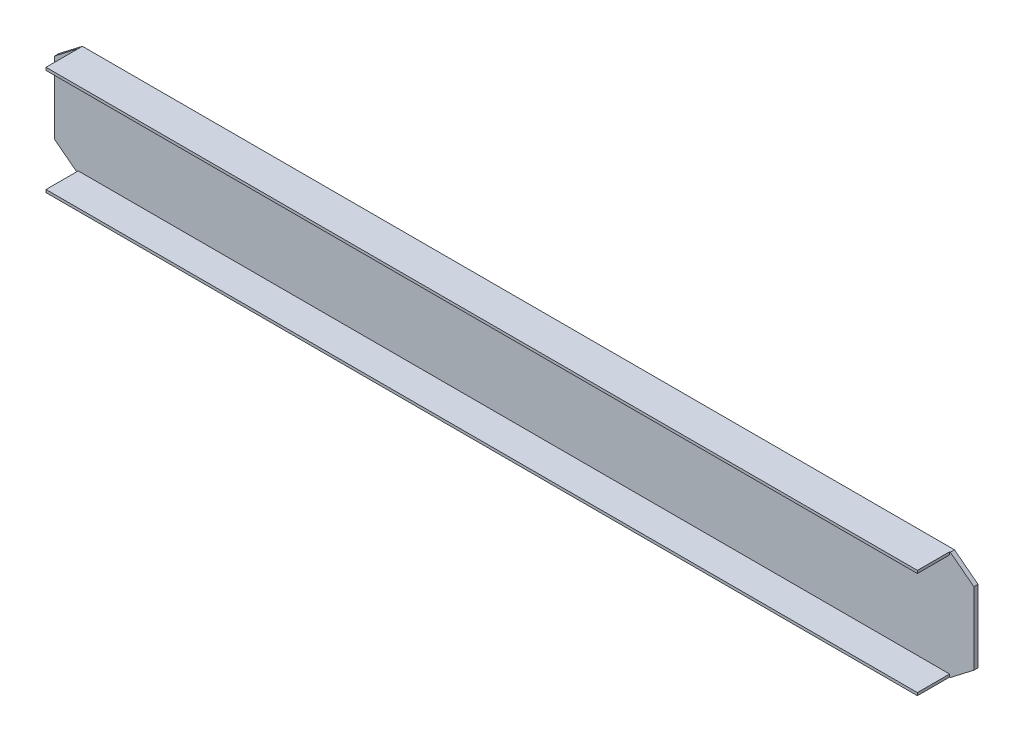
ISO-10303-21;
HEADER;
FILE_DESCRIPTION(('STEP AP214'),'2;1');
FILE_NAME('part.step','',(''),(''),'','','');
FILE_SCHEMA(('AUTOMOTIVE_DESIGN { 1 0 10303 214 1 1 1 1 }'));
ENDSEC;
DATA;
#1=APPLICATION_CONTEXT('core data for automotive mechanical design processes');
#2=APPLICATION_PROTOCOL_DEFINITION('international standard','automotive_design',2000,#1);
#3=PRODUCT_CONTEXT('',#1,'mechanical');
#4=PRODUCT('Part','Part','',(#3));
#5=PRODUCT_RELATED_PRODUCT_CATEGORY('part','',(#4));
#6=PRODUCT_DEFINITION_FORMATION('','',#4);
#7=PRODUCT_DEFINITION_CONTEXT('part definition',#1,'design');
#8=PRODUCT_DEFINITION('design','',#6,#7);
#9=PRODUCT_DEFINITION_SHAPE('','',#8);
#10=(LENGTH_UNIT() NAMED_UNIT(*) SI_UNIT(.MILLI.,.METRE.));
#11=(NAMED_UNIT(*) PLANE_ANGLE_UNIT() SI_UNIT($,.RADIAN.));
#12=(NAMED_UNIT(*) SI_UNIT($,.STERADIAN.) SOLID_ANGLE_UNIT());
#13=UNCERTAINTY_MEASURE_WITH_UNIT(LENGTH_MEASURE(1.E-05),#10,'distance_accuracy_value','');
#14=(GEOMETRIC_REPRESENTATION_CONTEXT(3) GLOBAL_UNCERTAINTY_ASSIGNED_CONTEXT((#13)) GLOBAL_UNIT_ASSIGNED_CONTEXT((#10,
#11,#12)) REPRESENTATION_CONTEXT('',''));
#15=CARTESIAN_POINT('',(0.,0.,0.));
#16=DIRECTION('',(0.,0.,1.));
#17=DIRECTION('',(1.,0.,0.));
#18=AXIS2_PLACEMENT_3D('',#15,#16,#17);
#19=CARTESIAN_POINT('',(0.,-926.923076923078,-11.5));
#20=DIRECTION('',(0.,0.,-1.));
#21=DIRECTION('',(-1.,0.,0.));
#22=AXIS2_PLACEMENT_3D('',#19,#20,#21);
#23=PLANE('',#22);
#24=DIRECTION('',(0.,-1.,0.));
#25=VECTOR('',#24,1.);
#26=CARTESIAN_POINT('',(-140.,270.,-11.5));
#27=LINE('',#26,#25);
#28=CARTESIAN_POINT('',(-140.,270.,-11.5));
#29=VERTEX_POINT('',#28);
#30=CARTESIAN_POINT('',(-140.,30.,-11.5));
#31=VERTEX_POINT('',#30);
#32=EDGE_CURVE('E267',#29,#31,#27,.T.);
#33=ORIENTED_EDGE('',*,*,#32,.F.);
#34=DIRECTION('',(1.,0.,0.));
#35=VECTOR('',#34,1.);
#36=CARTESIAN_POINT('',(-220.,270.,-11.5));
#37=LINE('',#36,#35);
#38=CARTESIAN_POINT('',(-220.,270.,-11.5));
#39=VERTEX_POINT('',#38);
#40=EDGE_CURVE('E264',#39,#29,#37,.T.);
#41=ORIENTED_EDGE('',*,*,#40,.F.);
#42=DIRECTION('',(0.,1.,0.));
#43=VECTOR('',#42,1.);
#44=CARTESIAN_POINT('',(-220.,270.,-11.5));
#45=LINE('',#44,#43);
#46=CARTESIAN_POINT('',(-220.,30.,-11.5));
#47=VERTEX_POINT('',#46);
#48=EDGE_CURVE('E276',#47,#39,#45,.T.);
#49=ORIENTED_EDGE('',*,*,#48,.F.);
#50=DIRECTION('',(-1.,0.,0.));
#51=VECTOR('',#50,1.);
#52=CARTESIAN_POINT('',(-220.,30.,-11.5));
#53=LINE('',#52,#51);
#54=EDGE_CURVE('E284',#31,#47,#53,.T.);
#55=ORIENTED_EDGE('',*,*,#54,.F.);
#56=EDGE_LOOP('',(#33,#41,#49,#55));
#57=FACE_BOUND('',#56,.T.);
#58=DIRECTION('',(-1.,0.,0.));
#59=VECTOR('',#58,1.);
#60=CARTESIAN_POINT('',(620.,30.,-11.5));
#61=LINE('',#60,#59);
#62=CARTESIAN_POINT('',(620.,30.,-11.5));
#63=VERTEX_POINT('',#62);
#64=CARTESIAN_POINT('',(540.,30.,-11.5));
#65=VERTEX_POINT('',#64);
#66=EDGE_CURVE('E338',#63,#65,#61,.T.);
#67=ORIENTED_EDGE('',*,*,#66,.F.);
#68=DIRECTION('',(0.,-1.,0.));
#69=VECTOR('',#68,1.);
#70=CARTESIAN_POINT('',(620.,270.,-11.5));
#71=LINE('',#70,#69);
#72=CARTESIAN_POINT('',(620.,270.,-11.5));
#73=VERTEX_POINT('',#72);
#74=EDGE_CURVE('E324',#73,#63,#71,.T.);
#75=ORIENTED_EDGE('',*,*,#74,.F.);
#76=DIRECTION('',(1.,0.,0.));
#77=VECTOR('',#76,1.);
#78=CARTESIAN_POINT('',(620.,270.,-11.5));
#79=LINE('',#78,#77);
#80=CARTESIAN_POINT('',(540.,270.,-11.5));
#81=VERTEX_POINT('',#80);
#82=EDGE_CURVE('E329',#81,#73,#79,.T.);
#83=ORIENTED_EDGE('',*,*,#82,.F.);
#84=DIRECTION('',(0.,1.,0.));
#85=VECTOR('',#84,1.);
#86=CARTESIAN_POINT('',(540.,270.,-11.5));
#87=LINE('',#86,#85);
#88=EDGE_CURVE('E340',#65,#81,#87,.T.);
#89=ORIENTED_EDGE('',*,*,#88,.F.);
#90=EDGE_LOOP('',(#67,#75,#83,#89));
#91=FACE_BOUND('',#90,.T.);
#92=DIRECTION('',(0.7926239891046,-0.609710760849693,0.));
#93=VECTOR('',#92,1.);
#94=CARTESIAN_POINT('',(-1270.,50.,-11.5));
#95=LINE('',#94,#93);
#96=CARTESIAN_POINT('',(-1270.,50.,-11.5));
#97=VERTEX_POINT('',#96);
#98=CARTESIAN_POINT('',(-1205.,0.,-11.5));
#99=VERTEX_POINT('',#98);
#100=EDGE_CURVE('E414',#97,#99,#95,.T.);
#101=ORIENTED_EDGE('',*,*,#100,.F.);
#102=DIRECTION('',(0.,-1.,0.));
#103=VECTOR('',#102,1.);
#104=CARTESIAN_POINT('',(-1270.,50.,-11.5));
#105=LINE('',#104,#103);
#106=CARTESIAN_POINT('',(-1270.,250.,-11.5));
#107=VERTEX_POINT('',#106);
#108=EDGE_CURVE('E436',#107,#97,#105,.T.);
#109=ORIENTED_EDGE('',*,*,#108,.F.);
#110=DIRECTION('',(-0.7926239891046,-0.609710760849693,0.));
#111=VECTOR('',#110,1.);
#112=CARTESIAN_POINT('',(-1270.,250.,-11.5));
#113=LINE('',#112,#111);
#114=CARTESIAN_POINT('',(-1205.,300.,-11.5));
#115=VERTEX_POINT('',#114);
#116=EDGE_CURVE('E433',#115,#107,#113,.T.);
#117=ORIENTED_EDGE('',*,*,#116,.F.);
#118=DIRECTION('',(-1.,0.,0.));
#119=VECTOR('',#118,1.);
#120=CARTESIAN_POINT('',(-1205.,300.,-11.5));
#121=LINE('',#120,#119);
#122=CARTESIAN_POINT('',(1205.,300.,-11.5));
#123=VERTEX_POINT('',#122);
#124=EDGE_CURVE('E430',#123,#115,#121,.T.);
#125=ORIENTED_EDGE('',*,*,#124,.F.);
#126=DIRECTION('',(-0.7926239891046,0.609710760849693,0.));
#127=VECTOR('',#126,1.);
#128=CARTESIAN_POINT('',(1270.,250.,-11.5));
#129=LINE('',#128,#127);
#130=CARTESIAN_POINT('',(1270.,250.,-11.5));
#131=VERTEX_POINT('',#130);
#132=EDGE_CURVE('E427',#131,#123,#129,.T.);
#133=ORIENTED_EDGE('',*,*,#132,.F.);
#134=DIRECTION('',(0.,1.,0.));
#135=VECTOR('',#134,1.);
#136=CARTESIAN_POINT('',(1270.,50.,-11.5));
#137=LINE('',#136,#135);
#138=CARTESIAN_POINT('',(1270.,50.,-11.5));
#139=VERTEX_POINT('',#138);
#140=EDGE_CURVE('E424',#139,#131,#137,.T.);
#141=ORIENTED_EDGE('',*,*,#140,.F.);
#142=DIRECTION('',(0.7926239891046,0.609710760849693,0.));
#143=VECTOR('',#142,1.);
#144=CARTESIAN_POINT('',(1270.,50.,-11.5));
#145=LINE('',#144,#143);
#146=CARTESIAN_POINT('',(1205.,0.,-11.5));
#147=VERTEX_POINT('',#146);
#148=EDGE_CURVE('E421',#147,#139,#145,.T.);
#149=ORIENTED_EDGE('',*,*,#148,.F.);
#150=DIRECTION('',(1.,0.,0.));
#151=VECTOR('',#150,1.);
#152=CARTESIAN_POINT('',(-1205.,0.,-11.5));
#153=LINE('',#152,#151);
#154=EDGE_CURVE('E417',#99,#147,#153,.T.);
#155=ORIENTED_EDGE('',*,*,#154,.F.);
#156=EDGE_LOOP('',(#101,#109,#117,#125,#133,#141,#149,#155));
#157=FACE_BOUND('',#156,.T.);
#158=DIRECTION('',(-1.,0.,0.));
#159=VECTOR('',#158,1.);
#160=CARTESIAN_POINT('',(220.,30.,-11.5));
#161=LINE('',#160,#159);
#162=CARTESIAN_POINT('',(220.,30.,-11.5));
#163=VERTEX_POINT('',#162);
#164=CARTESIAN_POINT('',(140.,30.,-11.5));
#165=VERTEX_POINT('',#164);
#166=EDGE_CURVE('E309',#163,#165,#161,.T.);
#167=ORIENTED_EDGE('',*,*,#166,.F.);
#168=DIRECTION('',(0.,-1.,0.));
#169=VECTOR('',#168,1.);
#170=CARTESIAN_POINT('',(220.,270.,-11.5));
#171=LINE('',#170,#169);
#172=CARTESIAN_POINT('',(220.,270.,-11.5));
#173=VERTEX_POINT('',#172);
#174=EDGE_CURVE('E295',#173,#163,#171,.T.);
#175=ORIENTED_EDGE('',*,*,#174,.F.);
#176=DIRECTION('',(1.,0.,0.));
#177=VECTOR('',#176,1.);
#178=CARTESIAN_POINT('',(220.,270.,-11.5));
#179=LINE('',#178,#177);
#180=CARTESIAN_POINT('',(140.,270.,-11.5));
#181=VERTEX_POINT('',#180);
#182=EDGE_CURVE('E300',#181,#173,#179,.T.);
#183=ORIENTED_EDGE('',*,*,#182,.F.);
#184=DIRECTION('',(0.,1.,0.));
#185=VECTOR('',#184,1.);
#186=CARTESIAN_POINT('',(140.,270.,-11.5));
#187=LINE('',#186,#185);
#188=EDGE_CURVE('E311',#165,#181,#187,.T.);
#189=ORIENTED_EDGE('',*,*,#188,.F.);
#190=EDGE_LOOP('',(#167,#175,#183,#189));
#191=FACE_BOUND('',#190,.T.);
#192=DIRECTION('',(0.,-1.,0.));
#193=VECTOR('',#192,1.);
#194=CARTESIAN_POINT('',(-540.,270.,-11.5));
#195=LINE('',#194,#193);
#196=CARTESIAN_POINT('',(-540.,270.,-11.5));
#197=VERTEX_POINT('',#196);
#198=CARTESIAN_POINT('',(-540.,30.,-11.5));
#199=VERTEX_POINT('',#198);
#200=EDGE_CURVE('E862',#197,#199,#195,.T.);
#201=ORIENTED_EDGE('',*,*,#200,.F.);
#202=DIRECTION('',(1.,0.,0.));
#203=VECTOR('',#202,1.);
#204=CARTESIAN_POINT('',(-620.,270.,-11.5));
#205=LINE('',#204,#203);
#206=CARTESIAN_POINT('',(-620.,270.,-11.5));
#207=VERTEX_POINT('',#206);
#208=EDGE_CURVE('E262',#207,#197,#205,.T.);
#209=ORIENTED_EDGE('',*,*,#208,.F.);
#210=DIRECTION('',(0.,1.,0.));
#211=VECTOR('',#210,1.);
#212=CARTESIAN_POINT('',(-620.,270.,-11.5));
#213=LINE('',#212,#211);
#214=CARTESIAN_POINT('',(-620.,30.,-11.5));
#215=VERTEX_POINT('',#214);
#216=EDGE_CURVE('E258',#215,#207,#213,.T.);
#217=ORIENTED_EDGE('',*,*,#216,.F.);
#218=DIRECTION('',(-1.,0.,0.));
#219=VECTOR('',#218,1.);
#220=CARTESIAN_POINT('',(-620.,30.,-11.5));
#221=LINE('',#220,#219);
#222=EDGE_CURVE('E864',#199,#215,#221,.T.);
#223=ORIENTED_EDGE('',*,*,#222,.F.);
#224=EDGE_LOOP('',(#201,#209,#217,#223));
#225=FACE_BOUND('',#224,.T.);
#226=ADVANCED_FACE('F34',(#57,#91,#157,#191,#225),#23,.T.);
#227=CARTESIAN_POINT('',(0.,-926.923076923078,0.));
#228=DIRECTION('',(0.,0.,-1.));
#229=DIRECTION('',(-1.,0.,0.));
#230=AXIS2_PLACEMENT_3D('',#227,#228,#229);
#231=PLANE('',#230);
#232=DIRECTION('',(0.,1.,0.));
#233=VECTOR('',#232,1.);
#234=CARTESIAN_POINT('',(1203.04903416362,0.,0.));
#235=LINE('',#234,#233);
#236=CARTESIAN_POINT('',(1203.04903416362,0.,0.));
#237=VERTEX_POINT('',#236);
#238=CARTESIAN_POINT('',(1203.04903416362,7.49999999999995,0.));
#239=VERTEX_POINT('',#238);
#240=EDGE_CURVE('E353',#237,#239,#235,.T.);
#241=ORIENTED_EDGE('',*,*,#240,.F.);
#242=DIRECTION('',(1.,0.,0.));
#243=VECTOR('',#242,1.);
#244=CARTESIAN_POINT('',(-1205.,0.,0.));
#245=LINE('',#244,#243);
#246=CARTESIAN_POINT('',(1205.,0.,0.));
#247=VERTEX_POINT('',#246);
#248=EDGE_CURVE('E441',#237,#247,#245,.T.);
#249=ORIENTED_EDGE('',*,*,#248,.T.);
#250=DIRECTION('',(0.7926239891046,0.609710760849693,0.));
#251=VECTOR('',#250,1.);
#252=CARTESIAN_POINT('',(1270.,50.,0.));
#253=LINE('',#252,#251);
#254=CARTESIAN_POINT('',(1270.,50.,0.));
#255=VERTEX_POINT('',#254);
#256=EDGE_CURVE('E443',#247,#255,#253,.T.);
#257=ORIENTED_EDGE('',*,*,#256,.T.);
#258=DIRECTION('',(0.,1.,0.));
#259=VECTOR('',#258,1.);
#260=CARTESIAN_POINT('',(1270.,50.,0.));
#261=LINE('',#260,#259);
#262=CARTESIAN_POINT('',(1270.,250.,0.));
#263=VERTEX_POINT('',#262);
#264=EDGE_CURVE('E446',#255,#263,#261,.T.);
#265=ORIENTED_EDGE('',*,*,#264,.T.);
#266=DIRECTION('',(-0.7926239891046,0.609710760849693,0.));
#267=VECTOR('',#266,1.);
#268=CARTESIAN_POINT('',(1270.,250.,0.));
#269=LINE('',#268,#267);
#270=CARTESIAN_POINT('',(1205.,300.,0.));
#271=VERTEX_POINT('',#270);
#272=EDGE_CURVE('E449',#263,#271,#269,.T.);
#273=ORIENTED_EDGE('',*,*,#272,.T.);
#274=DIRECTION('',(-1.,0.,0.));
#275=VECTOR('',#274,1.);
#276=CARTESIAN_POINT('',(-1205.,300.,0.));
#277=LINE('',#276,#275);
#278=CARTESIAN_POINT('',(1203.04903416362,300.,0.));
#279=VERTEX_POINT('',#278);
#280=EDGE_CURVE('E452',#271,#279,#277,.T.);
#281=ORIENTED_EDGE('',*,*,#280,.T.);
#282=DIRECTION('',(0.,1.,0.));
#283=VECTOR('',#282,1.);
#284=CARTESIAN_POINT('',(1203.04903416362,300.,0.));
#285=LINE('',#284,#283);
#286=CARTESIAN_POINT('',(1203.04903416362,292.5,0.));
#287=VERTEX_POINT('',#286);
#288=EDGE_CURVE('E388',#287,#279,#285,.T.);
#289=ORIENTED_EDGE('',*,*,#288,.F.);
#290=DIRECTION('',(1.,0.,0.));
#291=VECTOR('',#290,1.);
#292=CARTESIAN_POINT('',(-1205.,292.5,0.));
#293=LINE('',#292,#291);
#294=CARTESIAN_POINT('',(-1205.,292.5,0.));
#295=VERTEX_POINT('',#294);
#296=EDGE_CURVE('E397',#295,#287,#293,.T.);
#297=ORIENTED_EDGE('',*,*,#296,.F.);
#298=DIRECTION('',(0.,-1.,0.));
#299=VECTOR('',#298,1.);
#300=CARTESIAN_POINT('',(-1205.,300.,0.));
#301=LINE('',#300,#299);
#302=CARTESIAN_POINT('',(-1205.,300.,0.));
#303=VERTEX_POINT('',#302);
#304=EDGE_CURVE('E383',#303,#295,#301,.T.);
#305=ORIENTED_EDGE('',*,*,#304,.F.);
#306=DIRECTION('',(-0.7926239891046,-0.609710760849693,0.));
#307=VECTOR('',#306,1.);
#308=CARTESIAN_POINT('',(-1270.,250.,0.));
#309=LINE('',#308,#307);
#310=CARTESIAN_POINT('',(-1270.,250.,0.));
#311=VERTEX_POINT('',#310);
#312=EDGE_CURVE('E454',#303,#311,#309,.T.);
#313=ORIENTED_EDGE('',*,*,#312,.T.);
#314=DIRECTION('',(0.,-1.,0.));
#315=VECTOR('',#314,1.);
#316=CARTESIAN_POINT('',(-1270.,50.,0.));
#317=LINE('',#316,#315);
#318=CARTESIAN_POINT('',(-1270.,50.,0.));
#319=VERTEX_POINT('',#318);
#320=EDGE_CURVE('E418',#311,#319,#317,.T.);
#321=ORIENTED_EDGE('',*,*,#320,.T.);
#322=DIRECTION('',(0.7926239891046,-0.609710760849693,0.));
#323=VECTOR('',#322,1.);
#324=CARTESIAN_POINT('',(-1270.,50.,0.));
#325=LINE('',#324,#323);
#326=CARTESIAN_POINT('',(-1205.,0.,0.));
#327=VERTEX_POINT('',#326);
#328=EDGE_CURVE('E413',#319,#327,#325,.T.);
#329=ORIENTED_EDGE('',*,*,#328,.T.);
#330=DIRECTION('',(0.,-1.,0.));
#331=VECTOR('',#330,1.);
#332=CARTESIAN_POINT('',(-1205.,0.,0.));
#333=LINE('',#332,#331);
#334=CARTESIAN_POINT('',(-1205.,7.49999999999995,0.));
#335=VERTEX_POINT('',#334);
#336=EDGE_CURVE('E358',#335,#327,#333,.T.);
#337=ORIENTED_EDGE('',*,*,#336,.F.);
#338=DIRECTION('',(-1.,0.,0.));
#339=VECTOR('',#338,1.);
#340=CARTESIAN_POINT('',(-1205.,7.49999999999995,0.));
#341=LINE('',#340,#339);
#342=EDGE_CURVE('E367',#239,#335,#341,.T.);
#343=ORIENTED_EDGE('',*,*,#342,.F.);
#344=EDGE_LOOP('',(#241,#249,#257,#265,#273,#281,#289,#297,#305,#313,#321,#329,#337,#343));
#345=FACE_BOUND('',#344,.T.);
#346=ADVANCED_FACE('F478',(#345),#231,.F.);
#347=CARTESIAN_POINT('',(-1270.,50.,-11.5));
#348=DIRECTION('',(-0.609710760849693,-0.7926239891046,0.));
#349=DIRECTION('',(0.7926239891046,-0.609710760849693,0.));
#350=AXIS2_PLACEMENT_3D('',#347,#348,#349);
#351=PLANE('',#350);
#352=ORIENTED_EDGE('',*,*,#328,.F.);
#353=DIRECTION('',(0.,0.,1.));
#354=VECTOR('',#353,1.);
#355=CARTESIAN_POINT('',(-1270.,50.,-11.5));
#356=LINE('',#355,#354);
#357=EDGE_CURVE('E11',#97,#319,#356,.T.);
#358=ORIENTED_EDGE('',*,*,#357,.F.);
#359=ORIENTED_EDGE('',*,*,#100,.T.);
#360=DIRECTION('',(0.,0.,1.));
#361=VECTOR('',#360,1.);
#362=CARTESIAN_POINT('',(-1205.,0.,-11.5));
#363=LINE('',#362,#361);
#364=EDGE_CURVE('E38',#99,#327,#363,.T.);
#365=ORIENTED_EDGE('',*,*,#364,.T.);
#366=EDGE_LOOP('',(#352,#358,#359,#365));
#367=FACE_BOUND('',#366,.T.);
#368=ADVANCED_FACE('F36',(#367),#351,.T.);
#369=CARTESIAN_POINT('',(-1270.,50.,-11.5));
#370=DIRECTION('',(-1.,0.,0.));
#371=DIRECTION('',(0.,0.,1.));
#372=AXIS2_PLACEMENT_3D('',#369,#370,#371);
#373=PLANE('',#372);
#374=ORIENTED_EDGE('',*,*,#320,.F.);
#375=DIRECTION('',(0.,0.,1.));
#376=VECTOR('',#375,1.);
#377=CARTESIAN_POINT('',(-1270.,250.,-11.5));
#378=LINE('',#377,#376);
#379=EDGE_CURVE('E43',#107,#311,#378,.T.);
#380=ORIENTED_EDGE('',*,*,#379,.F.);
#381=ORIENTED_EDGE('',*,*,#108,.T.);
#382=ORIENTED_EDGE('',*,*,#357,.T.);
#383=EDGE_LOOP('',(#374,#380,#381,#382));
#384=FACE_BOUND('',#383,.T.);
#385=ADVANCED_FACE('F520',(#384),#373,.T.);
#386=CARTESIAN_POINT('',(-1270.,250.,-11.5));
#387=DIRECTION('',(-0.609710760849693,0.7926239891046,0.));
#388=DIRECTION('',(-0.7926239891046,-0.609710760849693,0.));
#389=AXIS2_PLACEMENT_3D('',#386,#387,#388);
#390=PLANE('',#389);
#391=ORIENTED_EDGE('',*,*,#312,.F.);
#392=DIRECTION('',(0.,0.,1.));
#393=VECTOR('',#392,1.);
#394=CARTESIAN_POINT('',(-1205.,300.,-11.5));
#395=LINE('',#394,#393);
#396=EDGE_CURVE('E460',#115,#303,#395,.T.);
#397=ORIENTED_EDGE('',*,*,#396,.F.);
#398=ORIENTED_EDGE('',*,*,#116,.T.);
#399=ORIENTED_EDGE('',*,*,#379,.T.);
#400=EDGE_LOOP('',(#391,#397,#398,#399));
#401=FACE_BOUND('',#400,.T.);
#402=ADVANCED_FACE('F523',(#401),#390,.T.);
#403=CARTESIAN_POINT('',(-1205.,300.,-11.5));
#404=DIRECTION('',(0.,1.,0.));
#405=DIRECTION('',(0.,0.,1.));
#406=AXIS2_PLACEMENT_3D('',#403,#404,#405);
#407=PLANE('',#406);
#408=DIRECTION('',(0.,0.,-1.));
#409=VECTOR('',#408,1.);
#410=CARTESIAN_POINT('',(1203.04903416362,300.,89.));
#411=LINE('',#410,#409);
#412=CARTESIAN_POINT('',(1203.04903416362,300.,89.));
#413=VERTEX_POINT('',#412);
#414=EDGE_CURVE('E404',#413,#279,#411,.T.);
#415=ORIENTED_EDGE('',*,*,#414,.T.);
#416=ORIENTED_EDGE('',*,*,#280,.F.);
#417=DIRECTION('',(0.,0.,1.));
#418=VECTOR('',#417,1.);
#419=CARTESIAN_POINT('',(1205.,300.,-11.5));
#420=LINE('',#419,#418);
#421=EDGE_CURVE('E463',#123,#271,#420,.T.);
#422=ORIENTED_EDGE('',*,*,#421,.F.);
#423=ORIENTED_EDGE('',*,*,#124,.T.);
#424=ORIENTED_EDGE('',*,*,#396,.T.);
#425=DIRECTION('',(0.,0.,-1.));
#426=VECTOR('',#425,1.);
#427=CARTESIAN_POINT('',(-1205.,300.,89.));
#428=LINE('',#427,#426);
#429=CARTESIAN_POINT('',(-1205.,300.,89.));
#430=VERTEX_POINT('',#429);
#431=EDGE_CURVE('E394',#430,#303,#428,.T.);
#432=ORIENTED_EDGE('',*,*,#431,.F.);
#433=DIRECTION('',(-1.,0.,0.));
#434=VECTOR('',#433,1.);
#435=CARTESIAN_POINT('',(-1205.,300.,89.));
#436=LINE('',#435,#434);
#437=EDGE_CURVE('E392',#413,#430,#436,.T.);
#438=ORIENTED_EDGE('',*,*,#437,.F.);
#439=EDGE_LOOP('',(#415,#416,#422,#423,#424,#432,#438));
#440=FACE_BOUND('',#439,.T.);
#441=ADVANCED_FACE('F527',(#440),#407,.T.);
#442=CARTESIAN_POINT('',(1270.,250.,-11.5));
#443=DIRECTION('',(0.609710760849693,0.7926239891046,0.));
#444=DIRECTION('',(-0.7926239891046,0.609710760849693,0.));
#445=AXIS2_PLACEMENT_3D('',#442,#443,#444);
#446=PLANE('',#445);
#447=ORIENTED_EDGE('',*,*,#272,.F.);
#448=DIRECTION('',(0.,0.,1.));
#449=VECTOR('',#448,1.);
#450=CARTESIAN_POINT('',(1270.,250.,-11.5));
#451=LINE('',#450,#449);
#452=EDGE_CURVE('E465',#131,#263,#451,.T.);
#453=ORIENTED_EDGE('',*,*,#452,.F.);
#454=ORIENTED_EDGE('',*,*,#132,.T.);
#455=ORIENTED_EDGE('',*,*,#421,.T.);
#456=EDGE_LOOP('',(#447,#453,#454,#455));
#457=FACE_BOUND('',#456,.T.);
#458=ADVANCED_FACE('F531',(#457),#446,.T.);
#459=CARTESIAN_POINT('',(1270.,50.,-11.5));
#460=DIRECTION('',(1.,0.,0.));
#461=DIRECTION('',(0.,0.,-1.));
#462=AXIS2_PLACEMENT_3D('',#459,#460,#461);
#463=PLANE('',#462);
#464=ORIENTED_EDGE('',*,*,#264,.F.);
#465=DIRECTION('',(0.,0.,1.));
#466=VECTOR('',#465,1.);
#467=CARTESIAN_POINT('',(1270.,50.,-11.5));
#468=LINE('',#467,#466);
#469=EDGE_CURVE('E467',#139,#255,#468,.T.);
#470=ORIENTED_EDGE('',*,*,#469,.F.);
#471=ORIENTED_EDGE('',*,*,#140,.T.);
#472=ORIENTED_EDGE('',*,*,#452,.T.);
#473=EDGE_LOOP('',(#464,#470,#471,#472));
#474=FACE_BOUND('',#473,.T.);
#475=ADVANCED_FACE('F535',(#474),#463,.T.);
#476=CARTESIAN_POINT('',(1270.,50.,-11.5));
#477=DIRECTION('',(0.609710760849693,-0.7926239891046,0.));
#478=DIRECTION('',(0.7926239891046,0.609710760849693,0.));
#479=AXIS2_PLACEMENT_3D('',#476,#477,#478);
#480=PLANE('',#479);
#481=ORIENTED_EDGE('',*,*,#256,.F.);
#482=DIRECTION('',(0.,0.,1.));
#483=VECTOR('',#482,1.);
#484=CARTESIAN_POINT('',(1205.,0.,-11.5));
#485=LINE('',#484,#483);
#486=EDGE_CURVE('E468',#147,#247,#485,.T.);
#487=ORIENTED_EDGE('',*,*,#486,.F.);
#488=ORIENTED_EDGE('',*,*,#148,.T.);
#489=ORIENTED_EDGE('',*,*,#469,.T.);
#490=EDGE_LOOP('',(#481,#487,#488,#489));
#491=FACE_BOUND('',#490,.T.);
#492=ADVANCED_FACE('F539',(#491),#480,.T.);
#493=CARTESIAN_POINT('',(-1205.,0.,-11.5));
#494=DIRECTION('',(0.,-1.,0.));
#495=DIRECTION('',(0.,0.,-1.));
#496=AXIS2_PLACEMENT_3D('',#493,#494,#495);
#497=PLANE('',#496);
#498=DIRECTION('',(0.,0.,-1.));
#499=VECTOR('',#498,1.);
#500=CARTESIAN_POINT('',(-1205.,0.,89.));
#501=LINE('',#500,#499);
#502=CARTESIAN_POINT('',(-1205.,0.,89.));
#503=VERTEX_POINT('',#502);
#504=EDGE_CURVE('E364',#503,#327,#501,.T.);
#505=ORIENTED_EDGE('',*,*,#504,.T.);
#506=ORIENTED_EDGE('',*,*,#364,.F.);
#507=ORIENTED_EDGE('',*,*,#154,.T.);
#508=ORIENTED_EDGE('',*,*,#486,.T.);
#509=ORIENTED_EDGE('',*,*,#248,.F.);
#510=DIRECTION('',(0.,0.,-1.));
#511=VECTOR('',#510,1.);
#512=CARTESIAN_POINT('',(1203.04903416362,0.,89.));
#513=LINE('',#512,#511);
#514=CARTESIAN_POINT('',(1203.04903416362,0.,89.));
#515=VERTEX_POINT('',#514);
#516=EDGE_CURVE('E380',#515,#237,#513,.T.);
#517=ORIENTED_EDGE('',*,*,#516,.F.);
#518=DIRECTION('',(1.,0.,0.));
#519=VECTOR('',#518,1.);
#520=CARTESIAN_POINT('',(-1205.,0.,89.));
#521=LINE('',#520,#519);
#522=EDGE_CURVE('E354',#503,#515,#521,.T.);
#523=ORIENTED_EDGE('',*,*,#522,.F.);
#524=EDGE_LOOP('',(#505,#506,#507,#508,#509,#517,#523));
#525=FACE_BOUND('',#524,.T.);
#526=ADVANCED_FACE('F486',(#525),#497,.T.);
#527=CARTESIAN_POINT('',(-1205.,300.,89.));
#528=DIRECTION('',(1.,0.,0.));
#529=DIRECTION('',(0.,0.,-1.));
#530=AXIS2_PLACEMENT_3D('',#527,#528,#529);
#531=PLANE('',#530);
#532=ORIENTED_EDGE('',*,*,#304,.T.);
#533=DIRECTION('',(0.,0.,-1.));
#534=VECTOR('',#533,1.);
#535=CARTESIAN_POINT('',(-1205.,292.5,89.));
#536=LINE('',#535,#534);
#537=CARTESIAN_POINT('',(-1205.,292.5,89.));
#538=VERTEX_POINT('',#537);
#539=EDGE_CURVE('E410',#538,#295,#536,.T.);
#540=ORIENTED_EDGE('',*,*,#539,.F.);
#541=DIRECTION('',(0.,-1.,0.));
#542=VECTOR('',#541,1.);
#543=CARTESIAN_POINT('',(-1205.,300.,89.));
#544=LINE('',#543,#542);
#545=EDGE_CURVE('E384',#430,#538,#544,.T.);
#546=ORIENTED_EDGE('',*,*,#545,.F.);
#547=ORIENTED_EDGE('',*,*,#431,.T.);
#548=EDGE_LOOP('',(#532,#540,#546,#547));
#549=FACE_BOUND('',#548,.T.);
#550=ADVANCED_FACE('F517',(#549),#531,.F.);
#551=CARTESIAN_POINT('',(-1205.,292.5,89.));
#552=DIRECTION('',(0.,1.,0.));
#553=DIRECTION('',(0.,0.,1.));
#554=AXIS2_PLACEMENT_3D('',#551,#552,#553);
#555=PLANE('',#554);
#556=ORIENTED_EDGE('',*,*,#296,.T.);
#557=DIRECTION('',(0.,0.,-1.));
#558=VECTOR('',#557,1.);
#559=CARTESIAN_POINT('',(1203.04903416362,292.5,89.));
#560=LINE('',#559,#558);
#561=CARTESIAN_POINT('',(1203.04903416362,292.5,89.));
#562=VERTEX_POINT('',#561);
#563=EDGE_CURVE('E407',#562,#287,#560,.T.);
#564=ORIENTED_EDGE('',*,*,#563,.F.);
#565=DIRECTION('',(1.,0.,0.));
#566=VECTOR('',#565,1.);
#567=CARTESIAN_POINT('',(-1205.,292.5,89.));
#568=LINE('',#567,#566);
#569=EDGE_CURVE('E387',#538,#562,#568,.T.);
#570=ORIENTED_EDGE('',*,*,#569,.F.);
#571=ORIENTED_EDGE('',*,*,#539,.T.);
#572=EDGE_LOOP('',(#556,#564,#570,#571));
#573=FACE_BOUND('',#572,.T.);
#574=ADVANCED_FACE('F547',(#573),#555,.F.);
#575=CARTESIAN_POINT('',(1203.04903416362,300.,89.));
#576=DIRECTION('',(-1.,0.,0.));
#577=DIRECTION('',(0.,0.,1.));
#578=AXIS2_PLACEMENT_3D('',#575,#576,#577);
#579=PLANE('',#578);
#580=ORIENTED_EDGE('',*,*,#288,.T.);
#581=ORIENTED_EDGE('',*,*,#414,.F.);
#582=DIRECTION('',(0.,1.,0.));
#583=VECTOR('',#582,1.);
#584=CARTESIAN_POINT('',(1203.04903416362,300.,89.));
#585=LINE('',#584,#583);
#586=EDGE_CURVE('E390',#562,#413,#585,.T.);
#587=ORIENTED_EDGE('',*,*,#586,.F.);
#588=ORIENTED_EDGE('',*,*,#563,.T.);
#589=EDGE_LOOP('',(#580,#581,#587,#588));
#590=FACE_BOUND('',#589,.T.);
#591=ADVANCED_FACE('F504',(#590),#579,.F.);
#592=CARTESIAN_POINT('',(-1205.,292.5,89.));
#593=DIRECTION('',(0.,0.,1.));
#594=DIRECTION('',(1.,0.,0.));
#595=AXIS2_PLACEMENT_3D('',#592,#593,#594);
#596=PLANE('',#595);
#597=ORIENTED_EDGE('',*,*,#545,.T.);
#598=ORIENTED_EDGE('',*,*,#569,.T.);
#599=ORIENTED_EDGE('',*,*,#586,.T.);
#600=ORIENTED_EDGE('',*,*,#437,.T.);
#601=EDGE_LOOP('',(#597,#598,#599,#600));
#602=FACE_BOUND('',#601,.T.);
#603=ADVANCED_FACE('F497',(#602),#596,.T.);
#604=CARTESIAN_POINT('',(1203.04903416362,0.,89.));
#605=DIRECTION('',(-1.,0.,0.));
#606=DIRECTION('',(0.,0.,1.));
#607=AXIS2_PLACEMENT_3D('',#604,#605,#606);
#608=PLANE('',#607);
#609=ORIENTED_EDGE('',*,*,#240,.T.);
#610=DIRECTION('',(0.,0.,-1.));
#611=VECTOR('',#610,1.);
#612=CARTESIAN_POINT('',(1203.04903416362,7.49999999999995,89.));
#613=LINE('',#612,#611);
#614=CARTESIAN_POINT('',(1203.04903416362,7.49999999999995,89.));
#615=VERTEX_POINT('',#614);
#616=EDGE_CURVE('E377',#615,#239,#613,.T.);
#617=ORIENTED_EDGE('',*,*,#616,.F.);
#618=DIRECTION('',(0.,1.,0.));
#619=VECTOR('',#618,1.);
#620=CARTESIAN_POINT('',(1203.04903416362,0.,89.));
#621=LINE('',#620,#619);
#622=EDGE_CURVE('E357',#515,#615,#621,.T.);
#623=ORIENTED_EDGE('',*,*,#622,.F.);
#624=ORIENTED_EDGE('',*,*,#516,.T.);
#625=EDGE_LOOP('',(#609,#617,#623,#624));
#626=FACE_BOUND('',#625,.T.);
#627=ADVANCED_FACE('F495',(#626),#608,.F.);
#628=CARTESIAN_POINT('',(-1205.,7.49999999999995,89.));
#629=DIRECTION('',(0.,-1.,0.));
#630=DIRECTION('',(0.,0.,-1.));
#631=AXIS2_PLACEMENT_3D('',#628,#629,#630);
#632=PLANE('',#631);
#633=ORIENTED_EDGE('',*,*,#342,.T.);
#634=DIRECTION('',(0.,0.,-1.));
#635=VECTOR('',#634,1.);
#636=CARTESIAN_POINT('',(-1205.,7.49999999999995,89.));
#637=LINE('',#636,#635);
#638=CARTESIAN_POINT('',(-1205.,7.49999999999995,89.));
#639=VERTEX_POINT('',#638);
#640=EDGE_CURVE('E374',#639,#335,#637,.T.);
#641=ORIENTED_EDGE('',*,*,#640,.F.);
#642=DIRECTION('',(-1.,0.,0.));
#643=VECTOR('',#642,1.);
#644=CARTESIAN_POINT('',(-1205.,7.49999999999995,89.));
#645=LINE('',#644,#643);
#646=EDGE_CURVE('E360',#615,#639,#645,.T.);
#647=ORIENTED_EDGE('',*,*,#646,.F.);
#648=ORIENTED_EDGE('',*,*,#616,.T.);
#649=EDGE_LOOP('',(#633,#641,#647,#648));
#650=FACE_BOUND('',#649,.T.);
#651=ADVANCED_FACE('F493',(#650),#632,.F.);
#652=CARTESIAN_POINT('',(-1205.,0.,89.));
#653=DIRECTION('',(1.,0.,0.));
#654=DIRECTION('',(0.,0.,-1.));
#655=AXIS2_PLACEMENT_3D('',#652,#653,#654);
#656=PLANE('',#655);
#657=ORIENTED_EDGE('',*,*,#336,.T.);
#658=ORIENTED_EDGE('',*,*,#504,.F.);
#659=DIRECTION('',(0.,-1.,0.));
#660=VECTOR('',#659,1.);
#661=CARTESIAN_POINT('',(-1205.,0.,89.));
#662=LINE('',#661,#660);
#663=EDGE_CURVE('E362',#639,#503,#662,.T.);
#664=ORIENTED_EDGE('',*,*,#663,.F.);
#665=ORIENTED_EDGE('',*,*,#640,.T.);
#666=EDGE_LOOP('',(#657,#658,#664,#665));
#667=FACE_BOUND('',#666,.T.);
#668=ADVANCED_FACE('F482',(#667),#656,.F.);
#669=CARTESIAN_POINT('',(1203.04903416362,0.,89.));
#670=DIRECTION('',(0.,0.,1.));
#671=DIRECTION('',(1.,0.,0.));
#672=AXIS2_PLACEMENT_3D('',#669,#670,#671);
#673=PLANE('',#672);
#674=ORIENTED_EDGE('',*,*,#522,.T.);
#675=ORIENTED_EDGE('',*,*,#622,.T.);
#676=ORIENTED_EDGE('',*,*,#646,.T.);
#677=ORIENTED_EDGE('',*,*,#663,.T.);
#678=EDGE_LOOP('',(#674,#675,#676,#677));
#679=FACE_BOUND('',#678,.T.);
#680=ADVANCED_FACE('F489',(#679),#673,.T.);
#681=CARTESIAN_POINT('',(620.,270.,-27.5));
#682=DIRECTION('',(-1.,0.,0.));
#683=DIRECTION('',(0.,0.,1.));
#684=AXIS2_PLACEMENT_3D('',#681,#682,#683);
#685=PLANE('',#684);
#686=ORIENTED_EDGE('',*,*,#74,.T.);
#687=DIRECTION('',(0.,0.,1.));
#688=VECTOR('',#687,1.);
#689=CARTESIAN_POINT('',(620.,30.,-27.5));
#690=LINE('',#689,#688);
#691=CARTESIAN_POINT('',(620.,30.,-27.5));
#692=VERTEX_POINT('',#691);
#693=EDGE_CURVE('E351',#692,#63,#690,.T.);
#694=ORIENTED_EDGE('',*,*,#693,.F.);
#695=DIRECTION('',(0.,-1.,0.));
#696=VECTOR('',#695,1.);
#697=CARTESIAN_POINT('',(620.,270.,-27.5));
#698=LINE('',#697,#696);
#699=CARTESIAN_POINT('',(620.,270.,-27.5));
#700=VERTEX_POINT('',#699);
#701=EDGE_CURVE('E325',#700,#692,#698,.T.);
#702=ORIENTED_EDGE('',*,*,#701,.F.);
#703=DIRECTION('',(0.,0.,1.));
#704=VECTOR('',#703,1.);
#705=CARTESIAN_POINT('',(620.,270.,-27.5));
#706=LINE('',#705,#704);
#707=EDGE_CURVE('E335',#700,#73,#706,.T.);
#708=ORIENTED_EDGE('',*,*,#707,.T.);
#709=EDGE_LOOP('',(#686,#694,#702,#708));
#710=FACE_BOUND('',#709,.T.);
#711=ADVANCED_FACE('F610',(#710),#685,.F.);
#712=CARTESIAN_POINT('',(620.,30.,-27.5));
#713=DIRECTION('',(0.,1.,0.));
#714=DIRECTION('',(-1.,0.,0.));
#715=AXIS2_PLACEMENT_3D('',#712,#713,#714);
#716=PLANE('',#715);
#717=ORIENTED_EDGE('',*,*,#66,.T.);
#718=DIRECTION('',(0.,0.,1.));
#719=VECTOR('',#718,1.);
#720=CARTESIAN_POINT('',(540.,30.,-27.5));
#721=LINE('',#720,#719);
#722=CARTESIAN_POINT('',(540.,30.,-27.5));
#723=VERTEX_POINT('',#722);
#724=EDGE_CURVE('E348',#723,#65,#721,.T.);
#725=ORIENTED_EDGE('',*,*,#724,.F.);
#726=DIRECTION('',(-1.,0.,0.));
#727=VECTOR('',#726,1.);
#728=CARTESIAN_POINT('',(620.,30.,-27.5));
#729=LINE('',#728,#727);
#730=EDGE_CURVE('E328',#692,#723,#729,.T.);
#731=ORIENTED_EDGE('',*,*,#730,.F.);
#732=ORIENTED_EDGE('',*,*,#693,.T.);
#733=EDGE_LOOP('',(#717,#725,#731,#732));
#734=FACE_BOUND('',#733,.T.);
#735=ADVANCED_FACE('F620',(#734),#716,.F.);
#736=CARTESIAN_POINT('',(540.,270.,-27.5));
#737=DIRECTION('',(1.,0.,0.));
#738=DIRECTION('',(0.,1.,0.));
#739=AXIS2_PLACEMENT_3D('',#736,#737,#738);
#740=PLANE('',#739);
#741=ORIENTED_EDGE('',*,*,#88,.T.);
#742=DIRECTION('',(0.,0.,1.));
#743=VECTOR('',#742,1.);
#744=CARTESIAN_POINT('',(540.,270.,-27.5));
#745=LINE('',#744,#743);
#746=CARTESIAN_POINT('',(540.,270.,-27.5));
#747=VERTEX_POINT('',#746);
#748=EDGE_CURVE('E346',#747,#81,#745,.T.);
#749=ORIENTED_EDGE('',*,*,#748,.F.);
#750=DIRECTION('',(0.,1.,0.));
#751=VECTOR('',#750,1.);
#752=CARTESIAN_POINT('',(540.,270.,-27.5));
#753=LINE('',#752,#751);
#754=EDGE_CURVE('E331',#723,#747,#753,.T.);
#755=ORIENTED_EDGE('',*,*,#754,.F.);
#756=ORIENTED_EDGE('',*,*,#724,.T.);
#757=EDGE_LOOP('',(#741,#749,#755,#756));
#758=FACE_BOUND('',#757,.T.);
#759=ADVANCED_FACE('F630',(#758),#740,.F.);
#760=CARTESIAN_POINT('',(620.,270.,-27.5));
#761=DIRECTION('',(0.,-1.,0.));
#762=DIRECTION('',(0.,0.,-1.));
#763=AXIS2_PLACEMENT_3D('',#760,#761,#762);
#764=PLANE('',#763);
#765=ORIENTED_EDGE('',*,*,#82,.T.);
#766=ORIENTED_EDGE('',*,*,#707,.F.);
#767=DIRECTION('',(1.,0.,0.));
#768=VECTOR('',#767,1.);
#769=CARTESIAN_POINT('',(620.,270.,-27.5));
#770=LINE('',#769,#768);
#771=EDGE_CURVE('E333',#747,#700,#770,.T.);
#772=ORIENTED_EDGE('',*,*,#771,.F.);
#773=ORIENTED_EDGE('',*,*,#748,.T.);
#774=EDGE_LOOP('',(#765,#766,#772,#773));
#775=FACE_BOUND('',#774,.T.);
#776=ADVANCED_FACE('F640',(#775),#764,.F.);
#777=CARTESIAN_POINT('',(620.,270.,-27.5));
#778=DIRECTION('',(0.,0.,-1.));
#779=DIRECTION('',(-1.,0.,0.));
#780=AXIS2_PLACEMENT_3D('',#777,#778,#779);
#781=PLANE('',#780);
#782=ORIENTED_EDGE('',*,*,#701,.T.);
#783=ORIENTED_EDGE('',*,*,#730,.T.);
#784=ORIENTED_EDGE('',*,*,#754,.T.);
#785=ORIENTED_EDGE('',*,*,#771,.T.);
#786=EDGE_LOOP('',(#782,#783,#784,#785));
#787=FACE_BOUND('',#786,.T.);
#788=ADVANCED_FACE('F650',(#787),#781,.T.);
#789=CARTESIAN_POINT('',(220.,270.,-27.5));
#790=DIRECTION('',(-1.,0.,0.));
#791=DIRECTION('',(0.,-1.,0.));
#792=AXIS2_PLACEMENT_3D('',#789,#790,#791);
#793=PLANE('',#792);
#794=ORIENTED_EDGE('',*,*,#174,.T.);
#795=DIRECTION('',(0.,0.,1.));
#796=VECTOR('',#795,1.);
#797=CARTESIAN_POINT('',(220.,30.,-27.5));
#798=LINE('',#797,#796);
#799=CARTESIAN_POINT('',(220.,30.,-27.5));
#800=VERTEX_POINT('',#799);
#801=EDGE_CURVE('E322',#800,#163,#798,.T.);
#802=ORIENTED_EDGE('',*,*,#801,.F.);
#803=DIRECTION('',(0.,-1.,0.));
#804=VECTOR('',#803,1.);
#805=CARTESIAN_POINT('',(220.,270.,-27.5));
#806=LINE('',#805,#804);
#807=CARTESIAN_POINT('',(220.,270.,-27.5));
#808=VERTEX_POINT('',#807);
#809=EDGE_CURVE('E296',#808,#800,#806,.T.);
#810=ORIENTED_EDGE('',*,*,#809,.F.);
#811=DIRECTION('',(0.,0.,1.));
#812=VECTOR('',#811,1.);
#813=CARTESIAN_POINT('',(220.,270.,-27.5));
#814=LINE('',#813,#812);
#815=EDGE_CURVE('E306',#808,#173,#814,.T.);
#816=ORIENTED_EDGE('',*,*,#815,.T.);
#817=EDGE_LOOP('',(#794,#802,#810,#816));
#818=FACE_BOUND('',#817,.T.);
#819=ADVANCED_FACE('F658',(#818),#793,.F.);
#820=CARTESIAN_POINT('',(220.,30.,-27.5));
#821=DIRECTION('',(0.,1.,0.));
#822=DIRECTION('',(-1.,0.,0.));
#823=AXIS2_PLACEMENT_3D('',#820,#821,#822);
#824=PLANE('',#823);
#825=ORIENTED_EDGE('',*,*,#166,.T.);
#826=DIRECTION('',(0.,0.,1.));
#827=VECTOR('',#826,1.);
#828=CARTESIAN_POINT('',(140.,30.,-27.5));
#829=LINE('',#828,#827);
#830=CARTESIAN_POINT('',(140.,30.,-27.5));
#831=VERTEX_POINT('',#830);
#832=EDGE_CURVE('E319',#831,#165,#829,.T.);
#833=ORIENTED_EDGE('',*,*,#832,.F.);
#834=DIRECTION('',(-1.,0.,0.));
#835=VECTOR('',#834,1.);
#836=CARTESIAN_POINT('',(220.,30.,-27.5));
#837=LINE('',#836,#835);
#838=EDGE_CURVE('E299',#800,#831,#837,.T.);
#839=ORIENTED_EDGE('',*,*,#838,.F.);
#840=ORIENTED_EDGE('',*,*,#801,.T.);
#841=EDGE_LOOP('',(#825,#833,#839,#840));
#842=FACE_BOUND('',#841,.T.);
#843=ADVANCED_FACE('F663',(#842),#824,.F.);
#844=CARTESIAN_POINT('',(140.,270.,-27.5));
#845=DIRECTION('',(1.,0.,0.));
#846=DIRECTION('',(0.,0.,-1.));
#847=AXIS2_PLACEMENT_3D('',#844,#845,#846);
#848=PLANE('',#847);
#849=ORIENTED_EDGE('',*,*,#188,.T.);
#850=DIRECTION('',(0.,0.,1.));
#851=VECTOR('',#850,1.);
#852=CARTESIAN_POINT('',(140.,270.,-27.5));
#853=LINE('',#852,#851);
#854=CARTESIAN_POINT('',(140.,270.,-27.5));
#855=VERTEX_POINT('',#854);
#856=EDGE_CURVE('E317',#855,#181,#853,.T.);
#857=ORIENTED_EDGE('',*,*,#856,.F.);
#858=DIRECTION('',(0.,1.,0.));
#859=VECTOR('',#858,1.);
#860=CARTESIAN_POINT('',(140.,270.,-27.5));
#861=LINE('',#860,#859);
#862=EDGE_CURVE('E302',#831,#855,#861,.T.);
#863=ORIENTED_EDGE('',*,*,#862,.F.);
#864=ORIENTED_EDGE('',*,*,#832,.T.);
#865=EDGE_LOOP('',(#849,#857,#863,#864));
#866=FACE_BOUND('',#865,.T.);
#867=ADVANCED_FACE('F673',(#866),#848,.F.);
#868=CARTESIAN_POINT('',(220.,270.,-27.5));
#869=DIRECTION('',(0.,-1.,0.));
#870=DIRECTION('',(0.,0.,-1.));
#871=AXIS2_PLACEMENT_3D('',#868,#869,#870);
#872=PLANE('',#871);
#873=ORIENTED_EDGE('',*,*,#182,.T.);
#874=ORIENTED_EDGE('',*,*,#815,.F.);
#875=DIRECTION('',(1.,0.,0.));
#876=VECTOR('',#875,1.);
#877=CARTESIAN_POINT('',(220.,270.,-27.5));
#878=LINE('',#877,#876);
#879=EDGE_CURVE('E304',#855,#808,#878,.T.);
#880=ORIENTED_EDGE('',*,*,#879,.F.);
#881=ORIENTED_EDGE('',*,*,#856,.T.);
#882=EDGE_LOOP('',(#873,#874,#880,#881));
#883=FACE_BOUND('',#882,.T.);
#884=ADVANCED_FACE('F683',(#883),#872,.F.);
#885=CARTESIAN_POINT('',(220.,30.,-27.5));
#886=DIRECTION('',(0.,0.,-1.));
#887=DIRECTION('',(-1.,0.,0.));
#888=AXIS2_PLACEMENT_3D('',#885,#886,#887);
#889=PLANE('',#888);
#890=ORIENTED_EDGE('',*,*,#809,.T.);
#891=ORIENTED_EDGE('',*,*,#838,.T.);
#892=ORIENTED_EDGE('',*,*,#862,.T.);
#893=ORIENTED_EDGE('',*,*,#879,.T.);
#894=EDGE_LOOP('',(#890,#891,#892,#893));
#895=FACE_BOUND('',#894,.T.);
#896=ADVANCED_FACE('F693',(#895),#889,.T.);
#897=CARTESIAN_POINT('',(-220.,270.,-27.5));
#898=DIRECTION('',(0.,-1.,0.));
#899=DIRECTION('',(0.,0.,-1.));
#900=AXIS2_PLACEMENT_3D('',#897,#898,#899);
#901=PLANE('',#900);
#902=ORIENTED_EDGE('',*,*,#40,.T.);
#903=DIRECTION('',(0.,0.,1.));
#904=VECTOR('',#903,1.);
#905=CARTESIAN_POINT('',(-140.,270.,-27.5));
#906=LINE('',#905,#904);
#907=CARTESIAN_POINT('',(-140.,270.,-27.5));
#908=VERTEX_POINT('',#907);
#909=EDGE_CURVE('E293',#908,#29,#906,.T.);
#910=ORIENTED_EDGE('',*,*,#909,.F.);
#911=DIRECTION('',(1.,0.,0.));
#912=VECTOR('',#911,1.);
#913=CARTESIAN_POINT('',(-220.,270.,-27.5));
#914=LINE('',#913,#912);
#915=CARTESIAN_POINT('',(-220.,270.,-27.5));
#916=VERTEX_POINT('',#915);
#917=EDGE_CURVE('E272',#916,#908,#914,.T.);
#918=ORIENTED_EDGE('',*,*,#917,.F.);
#919=DIRECTION('',(0.,0.,1.));
#920=VECTOR('',#919,1.);
#921=CARTESIAN_POINT('',(-220.,270.,-27.5));
#922=LINE('',#921,#920);
#923=EDGE_CURVE('E281',#916,#39,#922,.T.);
#924=ORIENTED_EDGE('',*,*,#923,.T.);
#925=EDGE_LOOP('',(#902,#910,#918,#924));
#926=FACE_BOUND('',#925,.T.);
#927=ADVANCED_FACE('F701',(#926),#901,.F.);
#928=CARTESIAN_POINT('',(-140.,270.,-27.5));
#929=DIRECTION('',(-1.,0.,0.));
#930=DIRECTION('',(0.,0.,1.));
#931=AXIS2_PLACEMENT_3D('',#928,#929,#930);
#932=PLANE('',#931);
#933=ORIENTED_EDGE('',*,*,#32,.T.);
#934=DIRECTION('',(0.,0.,1.));
#935=VECTOR('',#934,1.);
#936=CARTESIAN_POINT('',(-140.,30.,-27.5));
#937=LINE('',#936,#935);
#938=CARTESIAN_POINT('',(-140.,30.,-27.5));
#939=VERTEX_POINT('',#938);
#940=EDGE_CURVE('E290',#939,#31,#937,.T.);
#941=ORIENTED_EDGE('',*,*,#940,.F.);
#942=DIRECTION('',(0.,-1.,0.));
#943=VECTOR('',#942,1.);
#944=CARTESIAN_POINT('',(-140.,270.,-27.5));
#945=LINE('',#944,#943);
#946=EDGE_CURVE('E275',#908,#939,#945,.T.);
#947=ORIENTED_EDGE('',*,*,#946,.F.);
#948=ORIENTED_EDGE('',*,*,#909,.T.);
#949=EDGE_LOOP('',(#933,#941,#947,#948));
#950=FACE_BOUND('',#949,.T.);
#951=ADVANCED_FACE('F706',(#950),#932,.F.);
#952=CARTESIAN_POINT('',(-220.,30.,-27.5));
#953=DIRECTION('',(0.,1.,0.));
#954=DIRECTION('',(-1.,0.,0.));
#955=AXIS2_PLACEMENT_3D('',#952,#953,#954);
#956=PLANE('',#955);
#957=ORIENTED_EDGE('',*,*,#54,.T.);
#958=DIRECTION('',(0.,0.,1.));
#959=VECTOR('',#958,1.);
#960=CARTESIAN_POINT('',(-220.,30.,-27.5));
#961=LINE('',#960,#959);
#962=CARTESIAN_POINT('',(-220.,30.,-27.5));
#963=VERTEX_POINT('',#962);
#964=EDGE_CURVE('E59',#963,#47,#961,.T.);
#965=ORIENTED_EDGE('',*,*,#964,.F.);
#966=DIRECTION('',(-1.,0.,0.));
#967=VECTOR('',#966,1.);
#968=CARTESIAN_POINT('',(-220.,30.,-27.5));
#969=LINE('',#968,#967);
#970=EDGE_CURVE('E278',#939,#963,#969,.T.);
#971=ORIENTED_EDGE('',*,*,#970,.F.);
#972=ORIENTED_EDGE('',*,*,#940,.T.);
#973=EDGE_LOOP('',(#957,#965,#971,#972));
#974=FACE_BOUND('',#973,.T.);
#975=ADVANCED_FACE('F716',(#974),#956,.F.);
#976=CARTESIAN_POINT('',(-220.,270.,-27.5));
#977=DIRECTION('',(1.,0.,0.));
#978=DIRECTION('',(0.,1.,0.));
#979=AXIS2_PLACEMENT_3D('',#976,#977,#978);
#980=PLANE('',#979);
#981=ORIENTED_EDGE('',*,*,#48,.T.);
#982=ORIENTED_EDGE('',*,*,#923,.F.);
#983=DIRECTION('',(0.,1.,0.));
#984=VECTOR('',#983,1.);
#985=CARTESIAN_POINT('',(-220.,270.,-27.5));
#986=LINE('',#985,#984);
#987=EDGE_CURVE('E280',#963,#916,#986,.T.);
#988=ORIENTED_EDGE('',*,*,#987,.F.);
#989=ORIENTED_EDGE('',*,*,#964,.T.);
#990=EDGE_LOOP('',(#981,#982,#988,#989));
#991=FACE_BOUND('',#990,.T.);
#992=ADVANCED_FACE('F726',(#991),#980,.F.);
#993=CARTESIAN_POINT('',(-140.,270.,-27.5));
#994=DIRECTION('',(0.,0.,-1.));
#995=DIRECTION('',(-1.,0.,0.));
#996=AXIS2_PLACEMENT_3D('',#993,#994,#995);
#997=PLANE('',#996);
#998=ORIENTED_EDGE('',*,*,#917,.T.);
#999=ORIENTED_EDGE('',*,*,#946,.T.);
#1000=ORIENTED_EDGE('',*,*,#970,.T.);
#1001=ORIENTED_EDGE('',*,*,#987,.T.);
#1002=EDGE_LOOP('',(#998,#999,#1000,#1001));
#1003=FACE_BOUND('',#1002,.T.);
#1004=ADVANCED_FACE('F736',(#1003),#997,.T.);
#1005=CARTESIAN_POINT('',(-620.,270.,-27.5));
#1006=DIRECTION('',(0.,-1.,0.));
#1007=DIRECTION('',(0.,0.,-1.));
#1008=AXIS2_PLACEMENT_3D('',#1005,#1006,#1007);
#1009=PLANE('',#1008);
#1010=ORIENTED_EDGE('',*,*,#208,.T.);
#1011=DIRECTION('',(0.,0.,1.));
#1012=VECTOR('',#1011,1.);
#1013=CARTESIAN_POINT('',(-540.,270.,-27.5));
#1014=LINE('',#1013,#1012);
#1015=CARTESIAN_POINT('',(-540.,270.,-27.5));
#1016=VERTEX_POINT('',#1015);
#1017=EDGE_CURVE('E243',#1016,#197,#1014,.T.);
#1018=ORIENTED_EDGE('',*,*,#1017,.F.);
#1019=DIRECTION('',(1.,0.,0.));
#1020=VECTOR('',#1019,1.);
#1021=CARTESIAN_POINT('',(-620.,270.,-27.5));
#1022=LINE('',#1021,#1020);
#1023=CARTESIAN_POINT('',(-620.,270.,-27.5));
#1024=VERTEX_POINT('',#1023);
#1025=EDGE_CURVE('E250',#1024,#1016,#1022,.T.);
#1026=ORIENTED_EDGE('',*,*,#1025,.F.);
#1027=DIRECTION('',(0.,0.,1.));
#1028=VECTOR('',#1027,1.);
#1029=CARTESIAN_POINT('',(-620.,270.,-27.5));
#1030=LINE('',#1029,#1028);
#1031=EDGE_CURVE('E871',#1024,#207,#1030,.T.);
#1032=ORIENTED_EDGE('',*,*,#1031,.T.);
#1033=EDGE_LOOP('',(#1010,#1018,#1026,#1032));
#1034=FACE_BOUND('',#1033,.T.);
#1035=ADVANCED_FACE('F260',(#1034),#1009,.F.);
#1036=CARTESIAN_POINT('',(-540.,270.,-27.5));
#1037=DIRECTION('',(-1.,0.,0.));
#1038=DIRECTION('',(0.,-1.,0.));
#1039=AXIS2_PLACEMENT_3D('',#1036,#1037,#1038);
#1040=PLANE('',#1039);
#1041=ORIENTED_EDGE('',*,*,#200,.T.);
#1042=DIRECTION('',(0.,0.,1.));
#1043=VECTOR('',#1042,1.);
#1044=CARTESIAN_POINT('',(-540.,30.,-27.5));
#1045=LINE('',#1044,#1043);
#1046=CARTESIAN_POINT('',(-540.,30.,-27.5));
#1047=VERTEX_POINT('',#1046);
#1048=EDGE_CURVE('E246',#1047,#199,#1045,.T.);
#1049=ORIENTED_EDGE('',*,*,#1048,.F.);
#1050=DIRECTION('',(0.,-1.,0.));
#1051=VECTOR('',#1050,1.);
#1052=CARTESIAN_POINT('',(-540.,270.,-27.5));
#1053=LINE('',#1052,#1051);
#1054=EDGE_CURVE('E239',#1016,#1047,#1053,.T.);
#1055=ORIENTED_EDGE('',*,*,#1054,.F.);
#1056=ORIENTED_EDGE('',*,*,#1017,.T.);
#1057=EDGE_LOOP('',(#1041,#1049,#1055,#1056));
#1058=FACE_BOUND('',#1057,.T.);
#1059=ADVANCED_FACE('F241',(#1058),#1040,.F.);
#1060=CARTESIAN_POINT('',(-620.,30.,-27.5));
#1061=DIRECTION('',(0.,1.,0.));
#1062=DIRECTION('',(-1.,0.,0.));
#1063=AXIS2_PLACEMENT_3D('',#1060,#1061,#1062);
#1064=PLANE('',#1063);
#1065=ORIENTED_EDGE('',*,*,#222,.T.);
#1066=DIRECTION('',(0.,0.,1.));
#1067=VECTOR('',#1066,1.);
#1068=CARTESIAN_POINT('',(-620.,30.,-27.5));
#1069=LINE('',#1068,#1067);
#1070=CARTESIAN_POINT('',(-620.,30.,-27.5));
#1071=VERTEX_POINT('',#1070);
#1072=EDGE_CURVE('E51',#1071,#215,#1069,.T.);
#1073=ORIENTED_EDGE('',*,*,#1072,.F.);
#1074=DIRECTION('',(-1.,0.,0.));
#1075=VECTOR('',#1074,1.);
#1076=CARTESIAN_POINT('',(-620.,30.,-27.5));
#1077=LINE('',#1076,#1075);
#1078=EDGE_CURVE('E249',#1047,#1071,#1077,.T.);
#1079=ORIENTED_EDGE('',*,*,#1078,.F.);
#1080=ORIENTED_EDGE('',*,*,#1048,.T.);
#1081=EDGE_LOOP('',(#1065,#1073,#1079,#1080));
#1082=FACE_BOUND('',#1081,.T.);
#1083=ADVANCED_FACE('F755',(#1082),#1064,.F.);
#1084=CARTESIAN_POINT('',(-620.,270.,-27.5));
#1085=DIRECTION('',(1.,0.,0.));
#1086=DIRECTION('',(0.,0.,-1.));
#1087=AXIS2_PLACEMENT_3D('',#1084,#1085,#1086);
#1088=PLANE('',#1087);
#1089=ORIENTED_EDGE('',*,*,#216,.T.);
#1090=ORIENTED_EDGE('',*,*,#1031,.F.);
#1091=DIRECTION('',(0.,1.,0.));
#1092=VECTOR('',#1091,1.);
#1093=CARTESIAN_POINT('',(-620.,270.,-27.5));
#1094=LINE('',#1093,#1092);
#1095=EDGE_CURVE('E254',#1071,#1024,#1094,.T.);
#1096=ORIENTED_EDGE('',*,*,#1095,.F.);
#1097=ORIENTED_EDGE('',*,*,#1072,.T.);
#1098=EDGE_LOOP('',(#1089,#1090,#1096,#1097));
#1099=FACE_BOUND('',#1098,.T.);
#1100=ADVANCED_FACE('F764',(#1099),#1088,.F.);
#1101=CARTESIAN_POINT('',(-620.,270.,-27.5));
#1102=DIRECTION('',(0.,0.,-1.));
#1103=DIRECTION('',(-1.,0.,0.));
#1104=AXIS2_PLACEMENT_3D('',#1101,#1102,#1103);
#1105=PLANE('',#1104);
#1106=ORIENTED_EDGE('',*,*,#1025,.T.);
#1107=ORIENTED_EDGE('',*,*,#1054,.T.);
#1108=ORIENTED_EDGE('',*,*,#1078,.T.);
#1109=ORIENTED_EDGE('',*,*,#1095,.T.);
#1110=EDGE_LOOP('',(#1106,#1107,#1108,#1109));
#1111=FACE_BOUND('',#1110,.T.);
#1112=ADVANCED_FACE('F253',(#1111),#1105,.T.);
#1113=CLOSED_SHELL('',(#226,#346,#368,#385,#402,#441,#458,#475,#492,#526,#550,#574,#591,#603,
#627,#651,#668,#680,#711,#735,#759,#776,#788,#819,#843,#867,#884,#896,#927,#951,#975,#992,#1004,
#1035,#1059,#1083,#1100,#1112));
#1114=MANIFOLD_SOLID_BREP('B2',#1113);
#1115=ADVANCED_BREP_SHAPE_REPRESENTATION('',(#18,#1114),#14);
#1116=SHAPE_DEFINITION_REPRESENTATION(#9,#1115);
ENDSEC;
END-ISO-10303-21;
